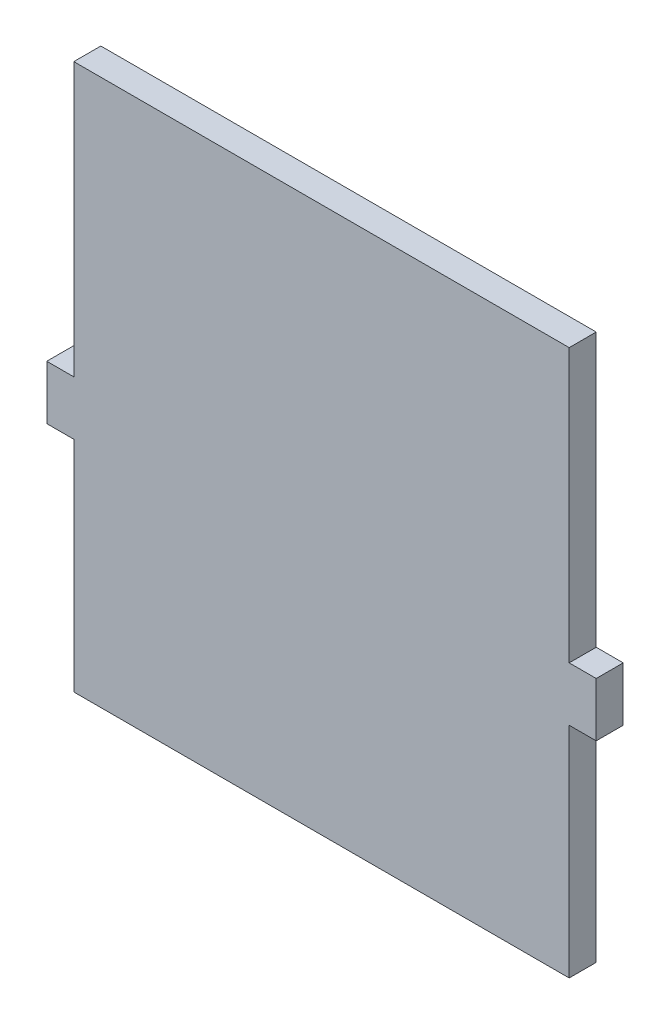
ISO-10303-21;
HEADER;
FILE_DESCRIPTION(('STEP AP214'),'2;1');
FILE_NAME('part.step','',(''),(''),'','','');
FILE_SCHEMA(('AUTOMOTIVE_DESIGN { 1 0 10303 214 1 1 1 1 }'));
ENDSEC;
DATA;
#1=APPLICATION_CONTEXT('core data for automotive mechanical design processes');
#2=APPLICATION_PROTOCOL_DEFINITION('international standard','automotive_design',2000,#1);
#3=PRODUCT_CONTEXT('',#1,'mechanical');
#4=PRODUCT('Part','Part','',(#3));
#5=PRODUCT_RELATED_PRODUCT_CATEGORY('part','',(#4));
#6=PRODUCT_DEFINITION_FORMATION('','',#4);
#7=PRODUCT_DEFINITION_CONTEXT('part definition',#1,'design');
#8=PRODUCT_DEFINITION('design','',#6,#7);
#9=PRODUCT_DEFINITION_SHAPE('','',#8);
#10=(LENGTH_UNIT() NAMED_UNIT(*) SI_UNIT(.MILLI.,.METRE.));
#11=(NAMED_UNIT(*) PLANE_ANGLE_UNIT() SI_UNIT($,.RADIAN.));
#12=(NAMED_UNIT(*) SI_UNIT($,.STERADIAN.) SOLID_ANGLE_UNIT());
#13=UNCERTAINTY_MEASURE_WITH_UNIT(LENGTH_MEASURE(1.E-05),#10,'distance_accuracy_value','');
#14=(GEOMETRIC_REPRESENTATION_CONTEXT(3) GLOBAL_UNCERTAINTY_ASSIGNED_CONTEXT((#13)) GLOBAL_UNIT_ASSIGNED_CONTEXT((#10,
#11,#12)) REPRESENTATION_CONTEXT('',''));
#15=CARTESIAN_POINT('',(0.,0.,0.));
#16=DIRECTION('',(0.,0.,1.));
#17=DIRECTION('',(1.,0.,0.));
#18=AXIS2_PLACEMENT_3D('',#15,#16,#17);
#19=CARTESIAN_POINT('',(0.,0.,3.));
#20=DIRECTION('',(1.,0.,0.));
#21=DIRECTION('',(0.,1.,0.));
#22=AXIS2_PLACEMENT_3D('',#19,#20,#21);
#23=PLANE('',#22);
#24=DIRECTION('',(0.,-1.,0.));
#25=VECTOR('',#24,1.);
#26=CARTESIAN_POINT('',(0.,0.,0.));
#27=LINE('',#26,#25);
#28=CARTESIAN_POINT('',(0.,0.,0.));
#29=VERTEX_POINT('',#28);
#30=CARTESIAN_POINT('',(0.,-30.31,0.));
#31=VERTEX_POINT('',#30);
#32=EDGE_CURVE('E159',#29,#31,#27,.T.);
#33=ORIENTED_EDGE('',*,*,#32,.T.);
#34=DIRECTION('',(0.,0.,-1.));
#35=VECTOR('',#34,1.);
#36=CARTESIAN_POINT('',(0.,-30.31,3.));
#37=LINE('',#36,#35);
#38=CARTESIAN_POINT('',(0.,-30.31,3.));
#39=VERTEX_POINT('',#38);
#40=EDGE_CURVE('E11',#39,#31,#37,.T.);
#41=ORIENTED_EDGE('',*,*,#40,.F.);
#42=DIRECTION('',(0.,-1.,0.));
#43=VECTOR('',#42,1.);
#44=CARTESIAN_POINT('',(0.,0.,3.));
#45=LINE('',#44,#43);
#46=CARTESIAN_POINT('',(0.,0.,3.));
#47=VERTEX_POINT('',#46);
#48=EDGE_CURVE('E181',#47,#39,#45,.T.);
#49=ORIENTED_EDGE('',*,*,#48,.F.);
#50=DIRECTION('',(0.,0.,-1.));
#51=VECTOR('',#50,1.);
#52=CARTESIAN_POINT('',(0.,0.,3.));
#53=LINE('',#52,#51);
#54=EDGE_CURVE('E155',#47,#29,#53,.T.);
#55=ORIENTED_EDGE('',*,*,#54,.T.);
#56=EDGE_LOOP('',(#33,#41,#49,#55));
#57=FACE_BOUND('',#56,.T.);
#58=ADVANCED_FACE('F39',(#57),#23,.F.);
#59=CARTESIAN_POINT('',(0.,-30.31,3.));
#60=DIRECTION('',(0.,-1.,0.));
#61=DIRECTION('',(0.,0.,-1.));
#62=AXIS2_PLACEMENT_3D('',#59,#60,#61);
#63=PLANE('',#62);
#64=DIRECTION('',(-1.,0.,0.));
#65=VECTOR('',#64,1.);
#66=CARTESIAN_POINT('',(0.,-30.31,0.));
#67=LINE('',#66,#65);
#68=CARTESIAN_POINT('',(-2.99999999999999,-30.31,0.));
#69=VERTEX_POINT('',#68);
#70=EDGE_CURVE('E162',#31,#69,#67,.T.);
#71=ORIENTED_EDGE('',*,*,#70,.T.);
#72=DIRECTION('',(0.,0.,-1.));
#73=VECTOR('',#72,1.);
#74=CARTESIAN_POINT('',(-2.99999999999999,-30.31,3.));
#75=LINE('',#74,#73);
#76=CARTESIAN_POINT('',(-2.99999999999999,-30.31,3.));
#77=VERTEX_POINT('',#76);
#78=EDGE_CURVE('E47',#77,#69,#75,.T.);
#79=ORIENTED_EDGE('',*,*,#78,.F.);
#80=DIRECTION('',(-1.,0.,0.));
#81=VECTOR('',#80,1.);
#82=CARTESIAN_POINT('',(0.,-30.31,3.));
#83=LINE('',#82,#81);
#84=EDGE_CURVE('E110',#39,#77,#83,.T.);
#85=ORIENTED_EDGE('',*,*,#84,.F.);
#86=ORIENTED_EDGE('',*,*,#40,.T.);
#87=EDGE_LOOP('',(#71,#79,#85,#86));
#88=FACE_BOUND('',#87,.T.);
#89=ADVANCED_FACE('F259',(#88),#63,.F.);
#90=CARTESIAN_POINT('',(-2.99999999999999,-30.31,3.));
#91=DIRECTION('',(1.,0.,0.));
#92=DIRECTION('',(0.,1.,0.));
#93=AXIS2_PLACEMENT_3D('',#90,#91,#92);
#94=PLANE('',#93);
#95=DIRECTION('',(0.,-1.,0.));
#96=VECTOR('',#95,1.);
#97=CARTESIAN_POINT('',(-2.99999999999999,-30.31,0.));
#98=LINE('',#97,#96);
#99=CARTESIAN_POINT('',(-2.99999999999999,-36.31,0.));
#100=VERTEX_POINT('',#99);
#101=EDGE_CURVE('E164',#69,#100,#98,.T.);
#102=ORIENTED_EDGE('',*,*,#101,.T.);
#103=DIRECTION('',(0.,0.,-1.));
#104=VECTOR('',#103,1.);
#105=CARTESIAN_POINT('',(-2.99999999999999,-36.31,3.));
#106=LINE('',#105,#104);
#107=CARTESIAN_POINT('',(-2.99999999999999,-36.31,3.));
#108=VERTEX_POINT('',#107);
#109=EDGE_CURVE('E200',#108,#100,#106,.T.);
#110=ORIENTED_EDGE('',*,*,#109,.F.);
#111=DIRECTION('',(0.,-1.,0.));
#112=VECTOR('',#111,1.);
#113=CARTESIAN_POINT('',(-2.99999999999999,-30.31,3.));
#114=LINE('',#113,#112);
#115=EDGE_CURVE('E208',#77,#108,#114,.T.);
#116=ORIENTED_EDGE('',*,*,#115,.F.);
#117=ORIENTED_EDGE('',*,*,#78,.T.);
#118=EDGE_LOOP('',(#102,#110,#116,#117));
#119=FACE_BOUND('',#118,.T.);
#120=ADVANCED_FACE('F206',(#119),#94,.F.);
#121=CARTESIAN_POINT('',(0.,-36.31,3.));
#122=DIRECTION('',(0.,1.,0.));
#123=DIRECTION('',(0.,0.,1.));
#124=AXIS2_PLACEMENT_3D('',#121,#122,#123);
#125=PLANE('',#124);
#126=DIRECTION('',(1.,0.,0.));
#127=VECTOR('',#126,1.);
#128=CARTESIAN_POINT('',(0.,-36.31,0.));
#129=LINE('',#128,#127);
#130=CARTESIAN_POINT('',(0.,-36.31,0.));
#131=VERTEX_POINT('',#130);
#132=EDGE_CURVE('E166',#100,#131,#129,.T.);
#133=ORIENTED_EDGE('',*,*,#132,.T.);
#134=DIRECTION('',(0.,0.,-1.));
#135=VECTOR('',#134,1.);
#136=CARTESIAN_POINT('',(0.,-36.31,3.));
#137=LINE('',#136,#135);
#138=CARTESIAN_POINT('',(0.,-36.31,3.));
#139=VERTEX_POINT('',#138);
#140=EDGE_CURVE('E197',#139,#131,#137,.T.);
#141=ORIENTED_EDGE('',*,*,#140,.F.);
#142=DIRECTION('',(1.,0.,0.));
#143=VECTOR('',#142,1.);
#144=CARTESIAN_POINT('',(0.,-36.31,3.));
#145=LINE('',#144,#143);
#146=EDGE_CURVE('E226',#108,#139,#145,.T.);
#147=ORIENTED_EDGE('',*,*,#146,.F.);
#148=ORIENTED_EDGE('',*,*,#109,.T.);
#149=EDGE_LOOP('',(#133,#141,#147,#148));
#150=FACE_BOUND('',#149,.T.);
#151=ADVANCED_FACE('F217',(#150),#125,.F.);
#152=CARTESIAN_POINT('',(0.,-36.31,3.));
#153=DIRECTION('',(1.,0.,0.));
#154=DIRECTION('',(0.,1.,0.));
#155=AXIS2_PLACEMENT_3D('',#152,#153,#154);
#156=PLANE('',#155);
#157=DIRECTION('',(0.,-1.,0.));
#158=VECTOR('',#157,1.);
#159=CARTESIAN_POINT('',(0.,-36.31,0.));
#160=LINE('',#159,#158);
#161=CARTESIAN_POINT('',(0.,-60.61,0.));
#162=VERTEX_POINT('',#161);
#163=EDGE_CURVE('E168',#131,#162,#160,.T.);
#164=ORIENTED_EDGE('',*,*,#163,.T.);
#165=DIRECTION('',(0.,0.,-1.));
#166=VECTOR('',#165,1.);
#167=CARTESIAN_POINT('',(0.,-60.61,3.));
#168=LINE('',#167,#166);
#169=CARTESIAN_POINT('',(0.,-60.61,3.));
#170=VERTEX_POINT('',#169);
#171=EDGE_CURVE('E194',#170,#162,#168,.T.);
#172=ORIENTED_EDGE('',*,*,#171,.F.);
#173=DIRECTION('',(0.,-1.,0.));
#174=VECTOR('',#173,1.);
#175=CARTESIAN_POINT('',(0.,-36.31,3.));
#176=LINE('',#175,#174);
#177=EDGE_CURVE('E223',#139,#170,#176,.T.);
#178=ORIENTED_EDGE('',*,*,#177,.F.);
#179=ORIENTED_EDGE('',*,*,#140,.T.);
#180=EDGE_LOOP('',(#164,#172,#178,#179));
#181=FACE_BOUND('',#180,.T.);
#182=ADVANCED_FACE('F221',(#181),#156,.F.);
#183=CARTESIAN_POINT('',(0.,-60.61,3.));
#184=DIRECTION('',(0.,1.,0.));
#185=DIRECTION('',(0.,0.,1.));
#186=AXIS2_PLACEMENT_3D('',#183,#184,#185);
#187=PLANE('',#186);
#188=DIRECTION('',(1.,0.,0.));
#189=VECTOR('',#188,1.);
#190=CARTESIAN_POINT('',(0.,-60.61,0.));
#191=LINE('',#190,#189);
#192=CARTESIAN_POINT('',(55.,-60.61,0.));
#193=VERTEX_POINT('',#192);
#194=EDGE_CURVE('E170',#162,#193,#191,.T.);
#195=ORIENTED_EDGE('',*,*,#194,.T.);
#196=DIRECTION('',(0.,0.,-1.));
#197=VECTOR('',#196,1.);
#198=CARTESIAN_POINT('',(55.,-60.61,3.));
#199=LINE('',#198,#197);
#200=CARTESIAN_POINT('',(55.,-60.61,3.));
#201=VERTEX_POINT('',#200);
#202=EDGE_CURVE('E191',#201,#193,#199,.T.);
#203=ORIENTED_EDGE('',*,*,#202,.F.);
#204=DIRECTION('',(1.,0.,0.));
#205=VECTOR('',#204,1.);
#206=CARTESIAN_POINT('',(0.,-60.61,3.));
#207=LINE('',#206,#205);
#208=EDGE_CURVE('E225',#170,#201,#207,.T.);
#209=ORIENTED_EDGE('',*,*,#208,.F.);
#210=ORIENTED_EDGE('',*,*,#171,.T.);
#211=EDGE_LOOP('',(#195,#203,#209,#210));
#212=FACE_BOUND('',#211,.T.);
#213=ADVANCED_FACE('F272',(#212),#187,.F.);
#214=CARTESIAN_POINT('',(55.,-36.31,3.));
#215=DIRECTION('',(-1.,0.,0.));
#216=DIRECTION('',(0.,-1.,0.));
#217=AXIS2_PLACEMENT_3D('',#214,#215,#216);
#218=PLANE('',#217);
#219=DIRECTION('',(0.,1.,0.));
#220=VECTOR('',#219,1.);
#221=CARTESIAN_POINT('',(55.,-36.31,0.));
#222=LINE('',#221,#220);
#223=CARTESIAN_POINT('',(55.,-36.31,0.));
#224=VERTEX_POINT('',#223);
#225=EDGE_CURVE('E172',#193,#224,#222,.T.);
#226=ORIENTED_EDGE('',*,*,#225,.T.);
#227=DIRECTION('',(0.,0.,-1.));
#228=VECTOR('',#227,1.);
#229=CARTESIAN_POINT('',(55.,-36.31,3.));
#230=LINE('',#229,#228);
#231=CARTESIAN_POINT('',(55.,-36.31,3.));
#232=VERTEX_POINT('',#231);
#233=EDGE_CURVE('E188',#232,#224,#230,.T.);
#234=ORIENTED_EDGE('',*,*,#233,.F.);
#235=DIRECTION('',(0.,1.,0.));
#236=VECTOR('',#235,1.);
#237=CARTESIAN_POINT('',(55.,-36.31,3.));
#238=LINE('',#237,#236);
#239=EDGE_CURVE('E228',#201,#232,#238,.T.);
#240=ORIENTED_EDGE('',*,*,#239,.F.);
#241=ORIENTED_EDGE('',*,*,#202,.T.);
#242=EDGE_LOOP('',(#226,#234,#240,#241));
#243=FACE_BOUND('',#242,.T.);
#244=ADVANCED_FACE('F275',(#243),#218,.F.);
#245=CARTESIAN_POINT('',(55.,-36.31,3.));
#246=DIRECTION('',(0.,1.,0.));
#247=DIRECTION('',(0.,0.,1.));
#248=AXIS2_PLACEMENT_3D('',#245,#246,#247);
#249=PLANE('',#248);
#250=DIRECTION('',(1.,0.,0.));
#251=VECTOR('',#250,1.);
#252=CARTESIAN_POINT('',(55.,-36.31,0.));
#253=LINE('',#252,#251);
#254=CARTESIAN_POINT('',(58.,-36.31,0.));
#255=VERTEX_POINT('',#254);
#256=EDGE_CURVE('E174',#224,#255,#253,.T.);
#257=ORIENTED_EDGE('',*,*,#256,.T.);
#258=DIRECTION('',(0.,0.,-1.));
#259=VECTOR('',#258,1.);
#260=CARTESIAN_POINT('',(58.,-36.31,3.));
#261=LINE('',#260,#259);
#262=CARTESIAN_POINT('',(58.,-36.31,3.));
#263=VERTEX_POINT('',#262);
#264=EDGE_CURVE('E185',#263,#255,#261,.T.);
#265=ORIENTED_EDGE('',*,*,#264,.F.);
#266=DIRECTION('',(1.,0.,0.));
#267=VECTOR('',#266,1.);
#268=CARTESIAN_POINT('',(55.,-36.31,3.));
#269=LINE('',#268,#267);
#270=EDGE_CURVE('E234',#232,#263,#269,.T.);
#271=ORIENTED_EDGE('',*,*,#270,.F.);
#272=ORIENTED_EDGE('',*,*,#233,.T.);
#273=EDGE_LOOP('',(#257,#265,#271,#272));
#274=FACE_BOUND('',#273,.T.);
#275=ADVANCED_FACE('F240',(#274),#249,.F.);
#276=CARTESIAN_POINT('',(58.,-30.31,3.));
#277=DIRECTION('',(-1.,0.,0.));
#278=DIRECTION('',(0.,0.,1.));
#279=AXIS2_PLACEMENT_3D('',#276,#277,#278);
#280=PLANE('',#279);
#281=DIRECTION('',(0.,1.,0.));
#282=VECTOR('',#281,1.);
#283=CARTESIAN_POINT('',(58.,-30.31,0.));
#284=LINE('',#283,#282);
#285=CARTESIAN_POINT('',(58.,-30.31,0.));
#286=VERTEX_POINT('',#285);
#287=EDGE_CURVE('E176',#255,#286,#284,.T.);
#288=ORIENTED_EDGE('',*,*,#287,.T.);
#289=DIRECTION('',(0.,0.,-1.));
#290=VECTOR('',#289,1.);
#291=CARTESIAN_POINT('',(58.,-30.31,3.));
#292=LINE('',#291,#290);
#293=CARTESIAN_POINT('',(58.,-30.31,3.));
#294=VERTEX_POINT('',#293);
#295=EDGE_CURVE('E150',#294,#286,#292,.T.);
#296=ORIENTED_EDGE('',*,*,#295,.F.);
#297=DIRECTION('',(0.,1.,0.));
#298=VECTOR('',#297,1.);
#299=CARTESIAN_POINT('',(58.,-30.31,3.));
#300=LINE('',#299,#298);
#301=EDGE_CURVE('E141',#263,#294,#300,.T.);
#302=ORIENTED_EDGE('',*,*,#301,.F.);
#303=ORIENTED_EDGE('',*,*,#264,.T.);
#304=EDGE_LOOP('',(#288,#296,#302,#303));
#305=FACE_BOUND('',#304,.T.);
#306=ADVANCED_FACE('F244',(#305),#280,.F.);
#307=CARTESIAN_POINT('',(55.,-30.31,3.));
#308=DIRECTION('',(0.,-1.,0.));
#309=DIRECTION('',(0.,0.,-1.));
#310=AXIS2_PLACEMENT_3D('',#307,#308,#309);
#311=PLANE('',#310);
#312=DIRECTION('',(-1.,0.,0.));
#313=VECTOR('',#312,1.);
#314=CARTESIAN_POINT('',(55.,-30.31,0.));
#315=LINE('',#314,#313);
#316=CARTESIAN_POINT('',(55.,-30.31,0.));
#317=VERTEX_POINT('',#316);
#318=EDGE_CURVE('E149',#286,#317,#315,.T.);
#319=ORIENTED_EDGE('',*,*,#318,.T.);
#320=DIRECTION('',(0.,0.,-1.));
#321=VECTOR('',#320,1.);
#322=CARTESIAN_POINT('',(55.,-30.31,3.));
#323=LINE('',#322,#321);
#324=CARTESIAN_POINT('',(55.,-30.31,3.));
#325=VERTEX_POINT('',#324);
#326=EDGE_CURVE('E146',#325,#317,#323,.T.);
#327=ORIENTED_EDGE('',*,*,#326,.F.);
#328=DIRECTION('',(-1.,0.,0.));
#329=VECTOR('',#328,1.);
#330=CARTESIAN_POINT('',(55.,-30.31,3.));
#331=LINE('',#330,#329);
#332=EDGE_CURVE('E135',#294,#325,#331,.T.);
#333=ORIENTED_EDGE('',*,*,#332,.F.);
#334=ORIENTED_EDGE('',*,*,#295,.T.);
#335=EDGE_LOOP('',(#319,#327,#333,#334));
#336=FACE_BOUND('',#335,.T.);
#337=ADVANCED_FACE('F147',(#336),#311,.F.);
#338=CARTESIAN_POINT('',(55.,0.,3.));
#339=DIRECTION('',(-1.,0.,0.));
#340=DIRECTION('',(0.,0.,1.));
#341=AXIS2_PLACEMENT_3D('',#338,#339,#340);
#342=PLANE('',#341);
#343=DIRECTION('',(0.,1.,0.));
#344=VECTOR('',#343,1.);
#345=CARTESIAN_POINT('',(55.,0.,0.));
#346=LINE('',#345,#344);
#347=CARTESIAN_POINT('',(55.,0.,0.));
#348=VERTEX_POINT('',#347);
#349=EDGE_CURVE('E96',#317,#348,#346,.T.);
#350=ORIENTED_EDGE('',*,*,#349,.T.);
#351=DIRECTION('',(0.,0.,-1.));
#352=VECTOR('',#351,1.);
#353=CARTESIAN_POINT('',(55.,0.,3.));
#354=LINE('',#353,#352);
#355=CARTESIAN_POINT('',(55.,0.,3.));
#356=VERTEX_POINT('',#355);
#357=EDGE_CURVE('E151',#356,#348,#354,.T.);
#358=ORIENTED_EDGE('',*,*,#357,.F.);
#359=DIRECTION('',(0.,1.,0.));
#360=VECTOR('',#359,1.);
#361=CARTESIAN_POINT('',(55.,0.,3.));
#362=LINE('',#361,#360);
#363=EDGE_CURVE('E139',#325,#356,#362,.T.);
#364=ORIENTED_EDGE('',*,*,#363,.F.);
#365=ORIENTED_EDGE('',*,*,#326,.T.);
#366=EDGE_LOOP('',(#350,#358,#364,#365));
#367=FACE_BOUND('',#366,.T.);
#368=ADVANCED_FACE('F153',(#367),#342,.F.);
#369=CARTESIAN_POINT('',(0.,0.,3.));
#370=DIRECTION('',(0.,-1.,0.));
#371=DIRECTION('',(0.,0.,-1.));
#372=AXIS2_PLACEMENT_3D('',#369,#370,#371);
#373=PLANE('',#372);
#374=DIRECTION('',(-1.,0.,0.));
#375=VECTOR('',#374,1.);
#376=CARTESIAN_POINT('',(0.,0.,0.));
#377=LINE('',#376,#375);
#378=EDGE_CURVE('E102',#348,#29,#377,.T.);
#379=ORIENTED_EDGE('',*,*,#378,.T.);
#380=ORIENTED_EDGE('',*,*,#54,.F.);
#381=DIRECTION('',(-1.,0.,0.));
#382=VECTOR('',#381,1.);
#383=CARTESIAN_POINT('',(0.,0.,3.));
#384=LINE('',#383,#382);
#385=EDGE_CURVE('E55',#356,#47,#384,.T.);
#386=ORIENTED_EDGE('',*,*,#385,.F.);
#387=ORIENTED_EDGE('',*,*,#357,.T.);
#388=EDGE_LOOP('',(#379,#380,#386,#387));
#389=FACE_BOUND('',#388,.T.);
#390=ADVANCED_FACE('F248',(#389),#373,.F.);
#391=CARTESIAN_POINT('',(0.,0.,3.));
#392=DIRECTION('',(0.,0.,-1.));
#393=DIRECTION('',(-1.,0.,0.));
#394=AXIS2_PLACEMENT_3D('',#391,#392,#393);
#395=PLANE('',#394);
#396=ORIENTED_EDGE('',*,*,#48,.T.);
#397=ORIENTED_EDGE('',*,*,#84,.T.);
#398=ORIENTED_EDGE('',*,*,#115,.T.);
#399=ORIENTED_EDGE('',*,*,#146,.T.);
#400=ORIENTED_EDGE('',*,*,#177,.T.);
#401=ORIENTED_EDGE('',*,*,#208,.T.);
#402=ORIENTED_EDGE('',*,*,#239,.T.);
#403=ORIENTED_EDGE('',*,*,#270,.T.);
#404=ORIENTED_EDGE('',*,*,#301,.T.);
#405=ORIENTED_EDGE('',*,*,#332,.T.);
#406=ORIENTED_EDGE('',*,*,#363,.T.);
#407=ORIENTED_EDGE('',*,*,#385,.T.);
#408=EDGE_LOOP('',(#396,#397,#398,#399,#400,#401,#402,#403,#404,#405,#406,#407));
#409=FACE_BOUND('',#408,.T.);
#410=ADVANCED_FACE('F137',(#409),#395,.F.);
#411=CARTESIAN_POINT('',(0.,0.,0.));
#412=DIRECTION('',(0.,0.,-1.));
#413=DIRECTION('',(-1.,0.,0.));
#414=AXIS2_PLACEMENT_3D('',#411,#412,#413);
#415=PLANE('',#414);
#416=ORIENTED_EDGE('',*,*,#32,.F.);
#417=ORIENTED_EDGE('',*,*,#378,.F.);
#418=ORIENTED_EDGE('',*,*,#349,.F.);
#419=ORIENTED_EDGE('',*,*,#318,.F.);
#420=ORIENTED_EDGE('',*,*,#287,.F.);
#421=ORIENTED_EDGE('',*,*,#256,.F.);
#422=ORIENTED_EDGE('',*,*,#225,.F.);
#423=ORIENTED_EDGE('',*,*,#194,.F.);
#424=ORIENTED_EDGE('',*,*,#163,.F.);
#425=ORIENTED_EDGE('',*,*,#132,.F.);
#426=ORIENTED_EDGE('',*,*,#101,.F.);
#427=ORIENTED_EDGE('',*,*,#70,.F.);
#428=EDGE_LOOP('',(#416,#417,#418,#419,#420,#421,#422,#423,#424,#425,#426,#427));
#429=FACE_BOUND('',#428,.T.);
#430=ADVANCED_FACE('F212',(#429),#415,.T.);
#431=CLOSED_SHELL('',(#58,#89,#120,#151,#182,#213,#244,#275,#306,#337,#368,#390,#410,#430));
#432=MANIFOLD_SOLID_BREP('B2',#431);
#433=ADVANCED_BREP_SHAPE_REPRESENTATION('',(#18,#432),#14);
#434=SHAPE_DEFINITION_REPRESENTATION(#9,#433);
ENDSEC;
END-ISO-10303-21;
